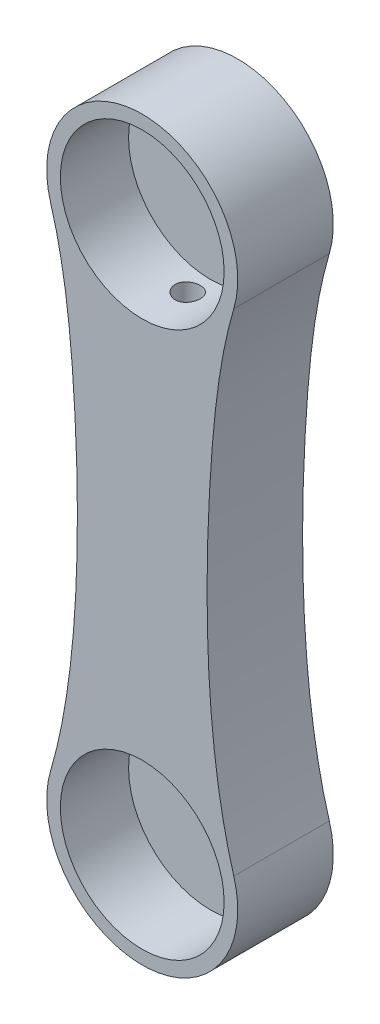
ISO-10303-21;
HEADER;
FILE_DESCRIPTION(('STEP AP214'),'2;1');
FILE_NAME('part.step','',(''),(''),'','','');
FILE_SCHEMA(('AUTOMOTIVE_DESIGN { 1 0 10303 214 1 1 1 1 }'));
ENDSEC;
DATA;
#1=APPLICATION_CONTEXT('core data for automotive mechanical design processes');
#2=APPLICATION_PROTOCOL_DEFINITION('international standard','automotive_design',2000,#1);
#3=PRODUCT_CONTEXT('',#1,'mechanical');
#4=PRODUCT('Part','Part','',(#3));
#5=PRODUCT_RELATED_PRODUCT_CATEGORY('part','',(#4));
#6=PRODUCT_DEFINITION_FORMATION('','',#4);
#7=PRODUCT_DEFINITION_CONTEXT('part definition',#1,'design');
#8=PRODUCT_DEFINITION('design','',#6,#7);
#9=PRODUCT_DEFINITION_SHAPE('','',#8);
#10=(LENGTH_UNIT() NAMED_UNIT(*) SI_UNIT(.MILLI.,.METRE.));
#11=(NAMED_UNIT(*) PLANE_ANGLE_UNIT() SI_UNIT($,.RADIAN.));
#12=(NAMED_UNIT(*) SI_UNIT($,.STERADIAN.) SOLID_ANGLE_UNIT());
#13=UNCERTAINTY_MEASURE_WITH_UNIT(LENGTH_MEASURE(1.E-05),#10,'distance_accuracy_value','');
#14=(GEOMETRIC_REPRESENTATION_CONTEXT(3) GLOBAL_UNCERTAINTY_ASSIGNED_CONTEXT((#13)) GLOBAL_UNIT_ASSIGNED_CONTEXT((#10,
#11,#12)) REPRESENTATION_CONTEXT('',''));
#15=CARTESIAN_POINT('',(0.,0.,0.));
#16=DIRECTION('',(0.,0.,1.));
#17=DIRECTION('',(1.,0.,0.));
#18=AXIS2_PLACEMENT_3D('',#15,#16,#17);
#19=CARTESIAN_POINT('',(0.,0.,21.));
#20=DIRECTION('',(0.,0.,-1.));
#21=DIRECTION('',(-1.,0.,0.));
#22=AXIS2_PLACEMENT_3D('',#19,#20,#21);
#23=CYLINDRICAL_SURFACE('',#22,18.);
#24=CARTESIAN_POINT('',(0.,0.,21.));
#25=DIRECTION('',(0.,0.,-1.));
#26=DIRECTION('',(-1.,0.,0.));
#27=AXIS2_PLACEMENT_3D('',#24,#25,#26);
#28=CIRCLE('',#27,18.);
#29=CARTESIAN_POINT('',(-18.,0.,21.));
#30=VERTEX_POINT('',#29);
#31=EDGE_CURVE('E105',#30,#30,#28,.T.);
#32=ORIENTED_EDGE('',*,*,#31,.F.);
#33=EDGE_LOOP('',(#32));
#34=FACE_BOUND('',#33,.T.);
#35=CARTESIAN_POINT('',(0.,0.,6.));
#36=DIRECTION('',(0.,0.,-1.));
#37=DIRECTION('',(-1.,0.,0.));
#38=AXIS2_PLACEMENT_3D('',#35,#36,#37);
#39=CIRCLE('',#38,18.);
#40=CARTESIAN_POINT('',(-18.,0.,6.));
#41=VERTEX_POINT('',#40);
#42=EDGE_CURVE('E102',#41,#41,#39,.T.);
#43=ORIENTED_EDGE('',*,*,#42,.T.);
#44=EDGE_LOOP('',(#43));
#45=FACE_BOUND('',#44,.T.);
#46=CARTESIAN_POINT('',(0.,18.,8.25));
#47=CARTESIAN_POINT('',(0.153510258517771,17.9999975087137,8.25000630431983));
#48=CARTESIAN_POINT('',(0.307108748270858,17.9980156561663,8.26289725277757));
#49=CARTESIAN_POINT('',(0.610010082310018,17.9903004084711,8.31410605565049));
#50=CARTESIAN_POINT('',(0.759308635853718,17.9845633929638,8.35244844835525));
#51=CARTESIAN_POINT('',(1.04918287274459,17.969982334475,8.45338573914497));
#52=CARTESIAN_POINT('',(1.18976514062071,17.9611406713259,8.51596206475397));
#53=CARTESIAN_POINT('',(1.45841306108697,17.9413265448084,8.66354499251799));
#54=CARTESIAN_POINT('',(1.58648039955886,17.9303543690371,8.74854856778228));
#55=CARTESIAN_POINT('',(1.82752030414948,17.9073994709621,8.93930574803975));
#56=CARTESIAN_POINT('',(1.94037692534286,17.8954100101608,9.04520506513373));
#57=CARTESIAN_POINT('',(2.14679126635228,17.8718243838362,9.27443405949152));
#58=CARTESIAN_POINT('',(2.24034785947817,17.8602282413069,9.39776475365022));
#59=CARTESIAN_POINT('',(2.40595992062668,17.8386768463986,9.65913745494312));
#60=CARTESIAN_POINT('',(2.47790280796093,17.8287303026849,9.79725157634658));
#61=CARTESIAN_POINT('',(2.59752573034174,17.8116965351506,10.0837804784073));
#62=CARTESIAN_POINT('',(2.64520713777126,17.8046091496026,10.2321946758872));
#63=CARTESIAN_POINT('',(2.71459266740928,17.7941625416485,10.5338898059226));
#64=CARTESIAN_POINT('',(2.73649556526652,17.7907748064245,10.6871240175174));
#65=CARTESIAN_POINT('',(2.75431820425983,17.7880245579266,10.9951274204015));
#66=CARTESIAN_POINT('',(2.75023949233129,17.7886618050067,11.1498965197562));
#67=CARTESIAN_POINT('',(2.7163770490849,17.7938634536805,11.4551698443492));
#68=CARTESIAN_POINT('',(2.68681500833727,17.7983939848453,11.6056993210139));
#69=CARTESIAN_POINT('',(2.60317223914235,17.8108187972326,11.8996361637298));
#70=CARTESIAN_POINT('',(2.54909079339747,17.8187131768617,12.0430433212865));
#71=CARTESIAN_POINT('',(2.4177147460771,17.8370134687077,12.3193374968786));
#72=CARTESIAN_POINT('',(2.34032653761683,17.8474294748001,12.4521793094906));
#73=CARTESIAN_POINT('',(2.16460036352424,17.8695921483484,12.7030756114045));
#74=CARTESIAN_POINT('',(2.06626097233227,17.8813389063258,12.8211290936111));
#75=CARTESIAN_POINT('',(1.85020847244248,17.9049890384903,13.0403822134443));
#76=CARTESIAN_POINT('',(1.7323048238499,17.9168927725239,13.1413941482134));
#77=CARTESIAN_POINT('',(1.48111927155989,17.9394024291803,13.3222260846295));
#78=CARTESIAN_POINT('',(1.34783729589168,17.9500083457288,13.4020459870917));
#79=CARTESIAN_POINT('',(1.06951357586518,17.968739053657,13.5382389003901));
#80=CARTESIAN_POINT('',(0.924464468827094,17.9768622762281,13.5945970939362));
#81=CARTESIAN_POINT('',(0.626808641329192,17.9896993017723,13.6821018493669));
#82=CARTESIAN_POINT('',(0.474202451886373,17.9944133439376,13.7132501800246));
#83=CARTESIAN_POINT('',(0.167384048823863,17.9998691068971,13.7492006531667));
#84=CARTESIAN_POINT('',(0.0132027310975914,18.0006497246001,13.7542607886286));
#85=CARTESIAN_POINT('',(-0.293806390814619,17.9982566697091,13.7385765097297));
#86=CARTESIAN_POINT('',(-0.446634238356828,17.9950831242453,13.7178329249833));
#87=CARTESIAN_POINT('',(-0.745814269065547,17.985162385829,13.6513445841472));
#88=CARTESIAN_POINT('',(-0.892195106608153,17.9784332110028,13.605725845786));
#89=CARTESIAN_POINT('',(-1.17523067164803,17.9621531873542,13.4909152688788));
#90=CARTESIAN_POINT('',(-1.31188492730701,17.9526022017608,13.4217222876829));
#91=CARTESIAN_POINT('',(-1.57272046839778,17.9316429904409,13.2611243928961));
#92=CARTESIAN_POINT('',(-1.69680013611226,17.9202213273972,13.1695562227642));
#93=CARTESIAN_POINT('',(-1.92792337862103,17.8968329827325,12.9670340931923));
#94=CARTESIAN_POINT('',(-2.03496592349731,17.8848662682185,12.8560789626332));
#95=CARTESIAN_POINT('',(-2.2299179391743,17.861612814413,12.6167825887925));
#96=CARTESIAN_POINT('',(-2.3176542434972,17.8503328377567,12.488299511022));
#97=CARTESIAN_POINT('',(-2.47029869195267,17.8298508320571,12.2182678145842));
#98=CARTESIAN_POINT('',(-2.53520747082072,17.8206487452393,12.0767195593415));
#99=CARTESIAN_POINT('',(-2.64008745388828,17.805413657673,11.7850867612954));
#100=CARTESIAN_POINT('',(-2.68014899573831,17.7993691895002,11.6350353322365));
#101=CARTESIAN_POINT('',(-2.73448433240165,17.7911034959988,11.3302345379749));
#102=CARTESIAN_POINT('',(-2.74875998066007,17.7888819958825,11.1754855112404));
#103=CARTESIAN_POINT('',(-2.75107298476152,17.7885242812649,10.8674087667602));
#104=CARTESIAN_POINT('',(-2.73938266024937,17.7903456666345,10.7140830735628));
#105=CARTESIAN_POINT('',(-2.69067997372575,17.7977762258774,10.4116058884679));
#106=CARTESIAN_POINT('',(-2.65366765844647,17.8033853927602,10.2624543888674));
#107=CARTESIAN_POINT('',(-2.55546923335161,17.8177444724682,9.97263970594377));
#108=CARTESIAN_POINT('',(-2.4943028661927,17.8264918197243,9.83196969812316));
#109=CARTESIAN_POINT('',(-2.34955984767611,17.8461446687613,9.56284431822716));
#110=CARTESIAN_POINT('',(-2.26598238045251,17.8570502491079,9.43438939106691));
#111=CARTESIAN_POINT('',(-2.07780301902395,17.8799268025333,9.19195817756364));
#112=CARTESIAN_POINT('',(-1.97299964094955,17.8919073213498,9.07813916851574));
#113=CARTESIAN_POINT('',(-1.74576924513527,17.915504732014,8.86960738777306));
#114=CARTESIAN_POINT('',(-1.62333814217073,17.9271215388095,8.77489905722932));
#115=CARTESIAN_POINT('',(-1.36350194297468,17.9487587527383,8.6067909532809));
#116=CARTESIAN_POINT('',(-1.22601517647366,17.9587696452251,8.53351620440508));
#117=CARTESIAN_POINT('',(-0.940596026165886,17.9759739335688,8.41120972055464));
#118=CARTESIAN_POINT('',(-0.792674575175969,17.983170228118,8.36215303020471));
#119=CARTESIAN_POINT('',(-0.536752834354808,17.9923033126744,8.3007278113183));
#120=CARTESIAN_POINT('',(-0.430327461410827,17.9951746513034,8.28173417460848));
#121=CARTESIAN_POINT('',(-0.215949268370734,17.9990238588584,8.25636813424484));
#122=CARTESIAN_POINT('',(-0.107996468354256,18.0000017526523,8.2499955648288));
#123=CARTESIAN_POINT('',(0.,18.,8.25));
#124=B_SPLINE_CURVE_WITH_KNOTS('',3,(#46,#47,#48,#49,#50,#51,#52,#53,#54,#55,#56,#57,#58,#59,
#60,#61,#62,#63,#64,#65,#66,#67,#68,#69,#70,#71,#72,#73,#74,#75,#76,#77,#78,#79,#80,#81,#82,#83,
#84,#85,#86,#87,#88,#89,#90,#91,#92,#93,#94,#95,#96,#97,#98,#99,#100,#101,#102,#103,#104,#105,
#106,#107,#108,#109,#110,#111,#112,#113,#114,#115,#116,#117,#118,#119,#120,#121,#122,#123),
.UNSPECIFIED.,.T.,.F.,(4,2,2,2,2,2,2,2,2,2,2,2,2,2,2,2,2,2,2,2,2,2,2,2,2,2,2,2,2,2,2,2,2,2,2,2,
2,2,4),(0.,0.460136124640792,0.920716522098308,1.38094463484242,1.84111066470757,
2.30460682483341,2.7681300351205,3.2340273592665,3.69989832637877,4.1621529685864,
4.62438008858149,5.08262621381426,5.54088574557351,6.00101090061293,6.46116737347662,
6.92610123230582,7.39103726711966,7.85626648939698,8.3214630674566,8.78205024767518,
9.24262261995608,9.7008831180374,10.1591658312913,10.6208977680364,11.0826576065327,
11.5484041018128,12.014137645658,12.4781678304506,12.9421646602345,13.4013182963538,
13.8604710850991,14.3192493530375,14.7780443248586,15.2414177016224,15.7048986385179,
16.1710315324576,16.6366830942957,16.9603991089365,17.2841108719368),.UNSPECIFIED.);
#125=CARTESIAN_POINT('',(0.,18.,8.25));
#126=VERTEX_POINT('',#125);
#127=EDGE_CURVE('E107',#126,#126,#124,.T.);
#128=ORIENTED_EDGE('',*,*,#127,.F.);
#129=EDGE_LOOP('',(#128));
#130=FACE_BOUND('',#129,.T.);
#131=ADVANCED_FACE('F35',(#34,#45,#130),#23,.F.);
#132=CARTESIAN_POINT('',(0.,120.,21.));
#133=DIRECTION('',(0.,0.,-1.));
#134=DIRECTION('',(-1.,0.,0.));
#135=AXIS2_PLACEMENT_3D('',#132,#133,#134);
#136=CYLINDRICAL_SURFACE('',#135,18.);
#137=CARTESIAN_POINT('',(0.,120.,21.));
#138=DIRECTION('',(0.,0.,-1.));
#139=DIRECTION('',(-1.,0.,0.));
#140=AXIS2_PLACEMENT_3D('',#137,#138,#139);
#141=CIRCLE('',#140,18.);
#142=CARTESIAN_POINT('',(-18.,120.,21.));
#143=VERTEX_POINT('',#142);
#144=EDGE_CURVE('E99',#143,#143,#141,.T.);
#145=ORIENTED_EDGE('',*,*,#144,.F.);
#146=EDGE_LOOP('',(#145));
#147=FACE_BOUND('',#146,.T.);
#148=CARTESIAN_POINT('',(0.,120.,6.));
#149=DIRECTION('',(0.,0.,-1.));
#150=DIRECTION('',(-1.,0.,0.));
#151=AXIS2_PLACEMENT_3D('',#148,#149,#150);
#152=CIRCLE('',#151,18.);
#153=CARTESIAN_POINT('',(-18.,120.,6.));
#154=VERTEX_POINT('',#153);
#155=EDGE_CURVE('E120',#154,#154,#152,.T.);
#156=ORIENTED_EDGE('',*,*,#155,.T.);
#157=EDGE_LOOP('',(#156));
#158=FACE_BOUND('',#157,.T.);
#159=CARTESIAN_POINT('',(0.,102.,8.25));
#160=CARTESIAN_POINT('',(-0.15351025851777,102.000002491286,8.25000630431983));
#161=CARTESIAN_POINT('',(-0.307108748270857,102.001984343834,8.26289725277757));
#162=CARTESIAN_POINT('',(-0.610010082310017,102.009699591529,8.31410605565049));
#163=CARTESIAN_POINT('',(-0.759308635853718,102.015436607036,8.35244844835525));
#164=CARTESIAN_POINT('',(-1.04918287274459,102.030017665525,8.45338573914497));
#165=CARTESIAN_POINT('',(-1.18976514062071,102.038859328674,8.51596206475397));
#166=CARTESIAN_POINT('',(-1.45841306108697,102.058673455192,8.66354499251799));
#167=CARTESIAN_POINT('',(-1.58648039955886,102.069645630963,8.74854856778228));
#168=CARTESIAN_POINT('',(-1.82752030414948,102.092600529038,8.93930574803975));
#169=CARTESIAN_POINT('',(-1.94037692534286,102.104589989839,9.04520506513373));
#170=CARTESIAN_POINT('',(-2.14679126635228,102.128175616164,9.27443405949152));
#171=CARTESIAN_POINT('',(-2.24034785947817,102.139771758693,9.39776475365022));
#172=CARTESIAN_POINT('',(-2.40595992062668,102.161323153601,9.65913745494312));
#173=CARTESIAN_POINT('',(-2.47790280796093,102.171269697315,9.79725157634658));
#174=CARTESIAN_POINT('',(-2.59752573034174,102.188303464849,10.0837804784073));
#175=CARTESIAN_POINT('',(-2.64520713777126,102.195390850397,10.2321946758872));
#176=CARTESIAN_POINT('',(-2.71459266740928,102.205837458352,10.5338898059226));
#177=CARTESIAN_POINT('',(-2.73649556526652,102.209225193575,10.6871240175174));
#178=CARTESIAN_POINT('',(-2.75431820425983,102.211975442073,10.9951274204015));
#179=CARTESIAN_POINT('',(-2.75023949233129,102.211338194993,11.1498965197562));
#180=CARTESIAN_POINT('',(-2.7163770490849,102.20613654632,11.4551698443492));
#181=CARTESIAN_POINT('',(-2.68681500833727,102.201606015155,11.6056993210139));
#182=CARTESIAN_POINT('',(-2.60317223914235,102.189181202767,11.8996361637298));
#183=CARTESIAN_POINT('',(-2.54909079339747,102.181286823138,12.0430433212865));
#184=CARTESIAN_POINT('',(-2.4177147460771,102.162986531292,12.3193374968786));
#185=CARTESIAN_POINT('',(-2.34032653761683,102.1525705252,12.4521793094906));
#186=CARTESIAN_POINT('',(-2.16460036352424,102.130407851652,12.7030756114045));
#187=CARTESIAN_POINT('',(-2.06626097233227,102.118661093674,12.8211290936111));
#188=CARTESIAN_POINT('',(-1.85020847244248,102.09501096151,13.0403822134443));
#189=CARTESIAN_POINT('',(-1.7323048238499,102.083107227476,13.1413941482134));
#190=CARTESIAN_POINT('',(-1.48111927155988,102.06059757082,13.3222260846295));
#191=CARTESIAN_POINT('',(-1.34783729589168,102.049991654271,13.4020459870917));
#192=CARTESIAN_POINT('',(-1.06951357586518,102.031260946343,13.5382389003901));
#193=CARTESIAN_POINT('',(-0.924464468827092,102.023137723772,13.5945970939362));
#194=CARTESIAN_POINT('',(-0.62680864132919,102.010300698228,13.6821018493669));
#195=CARTESIAN_POINT('',(-0.474202451886371,102.005586656062,13.7132501800246));
#196=CARTESIAN_POINT('',(-0.167384048823861,102.000130893103,13.7492006531667));
#197=CARTESIAN_POINT('',(-0.0132027310975895,101.9993502754,13.7542607886286));
#198=CARTESIAN_POINT('',(0.293806390814621,102.001743330291,13.7385765097297));
#199=CARTESIAN_POINT('',(0.44663423835683,102.004916875755,13.7178329249833));
#200=CARTESIAN_POINT('',(0.745814269065549,102.014837614171,13.6513445841472));
#201=CARTESIAN_POINT('',(0.892195106608154,102.021566788997,13.605725845786));
#202=CARTESIAN_POINT('',(1.17523067164804,102.037846812646,13.4909152688788));
#203=CARTESIAN_POINT('',(1.31188492730701,102.047397798239,13.4217222876829));
#204=CARTESIAN_POINT('',(1.57272046839778,102.068357009559,13.2611243928961));
#205=CARTESIAN_POINT('',(1.69680013611226,102.079778672603,13.1695562227642));
#206=CARTESIAN_POINT('',(1.92792337862103,102.103167017267,12.9670340931923));
#207=CARTESIAN_POINT('',(2.03496592349732,102.115133731781,12.8560789626332));
#208=CARTESIAN_POINT('',(2.22991793917431,102.138387185587,12.6167825887925));
#209=CARTESIAN_POINT('',(2.3176542434972,102.149667162243,12.488299511022));
#210=CARTESIAN_POINT('',(2.47029869195267,102.170149167943,12.2182678145842));
#211=CARTESIAN_POINT('',(2.53520747082072,102.179351254761,12.0767195593415));
#212=CARTESIAN_POINT('',(2.64008745388828,102.194586342327,11.7850867612954));
#213=CARTESIAN_POINT('',(2.68014899573831,102.2006308105,11.6350353322365));
#214=CARTESIAN_POINT('',(2.73448433240165,102.208896504001,11.3302345379749));
#215=CARTESIAN_POINT('',(2.74875998066007,102.211118004118,11.1754855112404));
#216=CARTESIAN_POINT('',(2.75107298476152,102.211475718735,10.8674087667602));
#217=CARTESIAN_POINT('',(2.73938266024937,102.209654333365,10.7140830735628));
#218=CARTESIAN_POINT('',(2.69067997372575,102.202223774123,10.4116058884679));
#219=CARTESIAN_POINT('',(2.65366765844647,102.19661460724,10.2624543888674));
#220=CARTESIAN_POINT('',(2.55546923335161,102.182255527532,9.97263970594376));
#221=CARTESIAN_POINT('',(2.4943028661927,102.173508180276,9.83196969812315));
#222=CARTESIAN_POINT('',(2.34955984767611,102.153855331239,9.56284431822716));
#223=CARTESIAN_POINT('',(2.2659823804525,102.142949750892,9.43438939106691));
#224=CARTESIAN_POINT('',(2.07780301902394,102.120073197467,9.19195817756363));
#225=CARTESIAN_POINT('',(1.97299964094955,102.10809267865,9.07813916851574));
#226=CARTESIAN_POINT('',(1.74576924513526,102.084495267986,8.86960738777306));
#227=CARTESIAN_POINT('',(1.62333814217072,102.07287846119,8.77489905722932));
#228=CARTESIAN_POINT('',(1.36350194297467,102.051241247262,8.60679095328089));
#229=CARTESIAN_POINT('',(1.22601517647366,102.041230354775,8.53351620440508));
#230=CARTESIAN_POINT('',(0.940596026165884,102.024026066431,8.41120972055464));
#231=CARTESIAN_POINT('',(0.792674575175967,102.016829771882,8.36215303020471));
#232=CARTESIAN_POINT('',(0.536752834354805,102.007696687326,8.3007278113183));
#233=CARTESIAN_POINT('',(0.430327461410824,102.004825348697,8.28173417460848));
#234=CARTESIAN_POINT('',(0.215949268370732,102.000976141142,8.25636813424484));
#235=CARTESIAN_POINT('',(0.107996468354255,101.999998247348,8.2499955648288));
#236=CARTESIAN_POINT('',(0.,102.,8.25));
#237=B_SPLINE_CURVE_WITH_KNOTS('',3,(#159,#160,#161,#162,#163,#164,#165,#166,#167,#168,#169,
#170,#171,#172,#173,#174,#175,#176,#177,#178,#179,#180,#181,#182,#183,#184,#185,#186,#187,#188,
#189,#190,#191,#192,#193,#194,#195,#196,#197,#198,#199,#200,#201,#202,#203,#204,#205,#206,#207,
#208,#209,#210,#211,#212,#213,#214,#215,#216,#217,#218,#219,#220,#221,#222,#223,#224,#225,#226,
#227,#228,#229,#230,#231,#232,#233,#234,#235,#236),.UNSPECIFIED.,.T.,.F.,(4,2,2,2,2,2,2,2,2,2,2,
2,2,2,2,2,2,2,2,2,2,2,2,2,2,2,2,2,2,2,2,2,2,2,2,2,2,2,4),(0.,0.460136124640791,
0.920716522098308,1.38094463484242,1.84111066470757,2.30460682483341,2.7681300351205,
3.23402735926651,3.69989832637877,4.1621529685864,4.62438008858149,5.08262621381427,
5.54088574557351,6.00101090061293,6.46116737347662,6.92610123230582,7.39103726711966,
7.85626648939698,8.32146306745661,8.78205024767519,9.24262261995608,9.7008831180374,
10.1591658312913,10.6208977680364,11.0826576065327,11.5484041018128,12.014137645658,
12.4781678304506,12.9421646602345,13.4013182963538,13.8604710850991,14.3192493530375,
14.7780443248586,15.2414177016224,15.7048986385179,16.1710315324576,16.6366830942957,
16.9603991089365,17.2841108719368),.UNSPECIFIED.);
#238=CARTESIAN_POINT('',(0.,102.,8.25));
#239=VERTEX_POINT('',#238);
#240=EDGE_CURVE('E39',#239,#239,#237,.T.);
#241=ORIENTED_EDGE('',*,*,#240,.F.);
#242=EDGE_LOOP('',(#241));
#243=FACE_BOUND('',#242,.T.);
#244=ADVANCED_FACE('F144',(#147,#158,#243),#136,.F.);
#245=CARTESIAN_POINT('',(0.,120.,21.));
#246=DIRECTION('',(0.,0.,-1.));
#247=DIRECTION('',(-1.,0.,0.));
#248=AXIS2_PLACEMENT_3D('',#245,#246,#247);
#249=CYLINDRICAL_SURFACE('',#248,21.);
#250=CARTESIAN_POINT('',(0.,120.,0.));
#251=DIRECTION('',(0.,0.,1.));
#252=DIRECTION('',(1.,0.,0.));
#253=AXIS2_PLACEMENT_3D('',#250,#251,#252);
#254=CIRCLE('',#253,21.);
#255=CARTESIAN_POINT('',(20.1246118072066,114.000000032563,0.));
#256=VERTEX_POINT('',#255);
#257=CARTESIAN_POINT('',(-20.1246117974981,114.,0.));
#258=VERTEX_POINT('',#257);
#259=EDGE_CURVE('E87',#256,#258,#254,.T.);
#260=ORIENTED_EDGE('',*,*,#259,.T.);
#261=DIRECTION('',(0.,0.,-1.));
#262=VECTOR('',#261,1.);
#263=CARTESIAN_POINT('',(-20.1246117974981,114.,21.));
#264=LINE('',#263,#262);
#265=CARTESIAN_POINT('',(-20.1246117974981,114.,21.));
#266=VERTEX_POINT('',#265);
#267=EDGE_CURVE('E91',#266,#258,#264,.T.);
#268=ORIENTED_EDGE('',*,*,#267,.F.);
#269=CARTESIAN_POINT('',(0.,120.,21.));
#270=DIRECTION('',(0.,0.,1.));
#271=DIRECTION('',(1.,0.,0.));
#272=AXIS2_PLACEMENT_3D('',#269,#270,#271);
#273=CIRCLE('',#272,21.);
#274=CARTESIAN_POINT('',(20.1246117974981,114.,21.));
#275=VERTEX_POINT('',#274);
#276=EDGE_CURVE('E89',#275,#266,#273,.T.);
#277=ORIENTED_EDGE('',*,*,#276,.F.);
#278=DIRECTION('',(0.,0.,-1.));
#279=VECTOR('',#278,1.);
#280=CARTESIAN_POINT('',(20.1246117974981,114.,21.));
#281=LINE('',#280,#279);
#282=EDGE_CURVE('E49',#275,#256,#281,.T.);
#283=ORIENTED_EDGE('',*,*,#282,.T.);
#284=EDGE_LOOP('',(#260,#268,#277,#283));
#285=FACE_BOUND('',#284,.T.);
#286=ADVANCED_FACE('F85',(#285),#249,.T.);
#287=CARTESIAN_POINT('',(0.,0.,5.));
#288=DIRECTION('',(0.,0.,-1.));
#289=DIRECTION('',(-1.,0.,0.));
#290=AXIS2_PLACEMENT_3D('',#287,#288,#289);
#291=CYLINDRICAL_SURFACE('',#290,21.);
#292=DIRECTION('',(0.,0.,-1.));
#293=VECTOR('',#292,1.);
#294=CARTESIAN_POINT('',(-20.1246117974981,5.99999999999998,21.));
#295=LINE('',#294,#293);
#296=CARTESIAN_POINT('',(-20.1246117974981,5.99999999999998,21.));
#297=VERTEX_POINT('',#296);
#298=CARTESIAN_POINT('',(-20.1246118001466,5.99999999111683,0.));
#299=VERTEX_POINT('',#298);
#300=EDGE_CURVE('E55',#297,#299,#295,.T.);
#301=ORIENTED_EDGE('',*,*,#300,.T.);
#302=CARTESIAN_POINT('',(0.,0.,0.));
#303=DIRECTION('',(0.,0.,1.));
#304=DIRECTION('',(1.,0.,0.));
#305=AXIS2_PLACEMENT_3D('',#302,#303,#304);
#306=CIRCLE('',#305,21.);
#307=CARTESIAN_POINT('',(20.1246117974981,6.,0.));
#308=VERTEX_POINT('',#307);
#309=EDGE_CURVE('E11',#299,#308,#306,.T.);
#310=ORIENTED_EDGE('',*,*,#309,.T.);
#311=DIRECTION('',(0.,0.,-1.));
#312=VECTOR('',#311,1.);
#313=CARTESIAN_POINT('',(20.1246117974981,6.,21.));
#314=LINE('',#313,#312);
#315=CARTESIAN_POINT('',(20.1246117974981,6.,21.));
#316=VERTEX_POINT('',#315);
#317=EDGE_CURVE('E63',#316,#308,#314,.T.);
#318=ORIENTED_EDGE('',*,*,#317,.F.);
#319=CARTESIAN_POINT('',(0.,0.,21.));
#320=DIRECTION('',(0.,0.,1.));
#321=DIRECTION('',(1.,0.,0.));
#322=AXIS2_PLACEMENT_3D('',#319,#320,#321);
#323=CIRCLE('',#322,21.);
#324=EDGE_CURVE('E197',#297,#316,#323,.T.);
#325=ORIENTED_EDGE('',*,*,#324,.F.);
#326=EDGE_LOOP('',(#301,#310,#318,#325));
#327=FACE_BOUND('',#326,.T.);
#328=ADVANCED_FACE('F138',(#327),#291,.T.);
#329=CARTESIAN_POINT('',(0.,0.,0.));
#330=DIRECTION('',(0.,0.,1.));
#331=DIRECTION('',(1.,0.,0.));
#332=AXIS2_PLACEMENT_3D('',#329,#330,#331);
#333=PLANE('',#332);
#334=ORIENTED_EDGE('',*,*,#309,.F.);
#335=CARTESIAN_POINT('',(-20.1246117974981,114.,0.));
#336=CARTESIAN_POINT('',(-17.0726623184333,103.763450251374,0.));
#337=CARTESIAN_POINT('',(-12.9542001169747,66.8976134133637,0.));
#338=CARTESIAN_POINT('',(-14.1806763598555,25.9365655386583,0.));
#339=CARTESIAN_POINT('',(-20.1246117974981,5.99999999999998,0.));
#340=B_SPLINE_CURVE_WITH_KNOTS('',3,(#335,#336,#337,#338,#339),.UNSPECIFIED.,.F.,.F.,(4,1,4),
(0.,0.31672468470437,1.),.UNSPECIFIED.);
#341=EDGE_CURVE('E97',#258,#299,#340,.T.);
#342=ORIENTED_EDGE('',*,*,#341,.F.);
#343=ORIENTED_EDGE('',*,*,#259,.F.);
#344=CARTESIAN_POINT('',(20.1246117974981,114.,0.));
#345=CARTESIAN_POINT('',(17.0726623184333,103.763450251374,0.));
#346=CARTESIAN_POINT('',(12.9542001169747,66.8976134133637,0.));
#347=CARTESIAN_POINT('',(14.1806763598555,25.9365655386583,0.));
#348=CARTESIAN_POINT('',(20.1246117974981,6.00000000000001,0.));
#349=B_SPLINE_CURVE_WITH_KNOTS('',3,(#344,#345,#346,#347,#348),.UNSPECIFIED.,.F.,.F.,(4,1,4),
(0.,0.31672468470437,1.),.UNSPECIFIED.);
#350=EDGE_CURVE('E95',#256,#308,#349,.T.);
#351=ORIENTED_EDGE('',*,*,#350,.T.);
#352=EDGE_LOOP('',(#334,#342,#343,#351));
#353=FACE_BOUND('',#352,.T.);
#354=ADVANCED_FACE('F37',(#353),#333,.F.);
#355=CARTESIAN_POINT('',(20.1246117974981,114.,21.));
#356=CARTESIAN_POINT('',(17.0726623184333,103.763450251374,21.));
#357=CARTESIAN_POINT('',(12.9542001169747,66.8976134133637,21.));
#358=CARTESIAN_POINT('',(14.1806763598555,25.9365655386583,21.));
#359=CARTESIAN_POINT('',(20.1246117974981,6.00000000000001,21.));
#360=B_SPLINE_CURVE_WITH_KNOTS('',3,(#355,#356,#357,#358,#359),.UNSPECIFIED.,.F.,.F.,(4,1,4),
(0.,0.31672468470437,1.),.UNSPECIFIED.);
#361=DIRECTION('',(0.,0.,-1.));
#362=VECTOR('',#361,1.);
#363=SURFACE_OF_LINEAR_EXTRUSION('',#360,#362);
#364=ORIENTED_EDGE('',*,*,#317,.T.);
#365=ORIENTED_EDGE('',*,*,#350,.F.);
#366=ORIENTED_EDGE('',*,*,#282,.F.);
#367=EDGE_CURVE('E98',#275,#316,#360,.T.);
#368=ORIENTED_EDGE('',*,*,#367,.T.);
#369=EDGE_LOOP('',(#364,#365,#366,#368));
#370=FACE_BOUND('',#369,.T.);
#371=ADVANCED_FACE('F101',(#370),#363,.T.);
#372=CARTESIAN_POINT('',(-20.1246117974981,114.,21.));
#373=CARTESIAN_POINT('',(-17.0726623184333,103.763450251374,21.));
#374=CARTESIAN_POINT('',(-12.9542001169747,66.8976134133637,21.));
#375=CARTESIAN_POINT('',(-14.1806763598555,25.9365655386583,21.));
#376=CARTESIAN_POINT('',(-20.1246117974981,5.99999999999998,21.));
#377=B_SPLINE_CURVE_WITH_KNOTS('',3,(#372,#373,#374,#375,#376),.UNSPECIFIED.,.F.,.F.,(4,1,4),
(0.,0.31672468470437,1.),.UNSPECIFIED.);
#378=DIRECTION('',(0.,0.,-1.));
#379=VECTOR('',#378,1.);
#380=SURFACE_OF_LINEAR_EXTRUSION('',#377,#379);
#381=ORIENTED_EDGE('',*,*,#267,.T.);
#382=ORIENTED_EDGE('',*,*,#341,.T.);
#383=ORIENTED_EDGE('',*,*,#300,.F.);
#384=EDGE_CURVE('E199',#266,#297,#377,.T.);
#385=ORIENTED_EDGE('',*,*,#384,.F.);
#386=EDGE_LOOP('',(#381,#382,#383,#385));
#387=FACE_BOUND('',#386,.T.);
#388=ADVANCED_FACE('F136',(#387),#380,.F.);
#389=CARTESIAN_POINT('',(0.,0.,21.));
#390=DIRECTION('',(0.,0.,1.));
#391=DIRECTION('',(1.,0.,0.));
#392=AXIS2_PLACEMENT_3D('',#389,#390,#391);
#393=PLANE('',#392);
#394=ORIENTED_EDGE('',*,*,#144,.T.);
#395=EDGE_LOOP('',(#394));
#396=FACE_BOUND('',#395,.T.);
#397=ORIENTED_EDGE('',*,*,#31,.T.);
#398=EDGE_LOOP('',(#397));
#399=FACE_BOUND('',#398,.T.);
#400=ORIENTED_EDGE('',*,*,#367,.F.);
#401=ORIENTED_EDGE('',*,*,#276,.T.);
#402=ORIENTED_EDGE('',*,*,#384,.T.);
#403=ORIENTED_EDGE('',*,*,#324,.T.);
#404=EDGE_LOOP('',(#400,#401,#402,#403));
#405=FACE_BOUND('',#404,.T.);
#406=ADVANCED_FACE('F158',(#396,#399,#405),#393,.T.);
#407=CARTESIAN_POINT('',(0.,0.,6.));
#408=DIRECTION('',(0.,0.,-1.));
#409=DIRECTION('',(-1.,0.,0.));
#410=AXIS2_PLACEMENT_3D('',#407,#408,#409);
#411=PLANE('',#410);
#412=ORIENTED_EDGE('',*,*,#42,.F.);
#413=EDGE_LOOP('',(#412));
#414=FACE_BOUND('',#413,.T.);
#415=ADVANCED_FACE('F157',(#414),#411,.F.);
#416=CARTESIAN_POINT('',(0.,120.,6.));
#417=DIRECTION('',(0.,0.,-1.));
#418=DIRECTION('',(-1.,0.,0.));
#419=AXIS2_PLACEMENT_3D('',#416,#417,#418);
#420=PLANE('',#419);
#421=ORIENTED_EDGE('',*,*,#155,.F.);
#422=EDGE_LOOP('',(#421));
#423=FACE_BOUND('',#422,.T.);
#424=ADVANCED_FACE('F167',(#423),#420,.F.);
#425=CARTESIAN_POINT('',(0.,114.,11.));
#426=DIRECTION('',(0.,-1.,0.));
#427=DIRECTION('',(0.,0.,-1.));
#428=AXIS2_PLACEMENT_3D('',#425,#426,#427);
#429=CYLINDRICAL_SURFACE('',#428,2.75);
#430=ORIENTED_EDGE('',*,*,#240,.T.);
#431=EDGE_LOOP('',(#430));
#432=FACE_BOUND('',#431,.T.);
#433=ORIENTED_EDGE('',*,*,#127,.T.);
#434=EDGE_LOOP('',(#433));
#435=FACE_BOUND('',#434,.T.);
#436=ADVANCED_FACE('F163',(#432,#435),#429,.F.);
#437=CLOSED_SHELL('',(#131,#244,#286,#328,#354,#371,#388,#406,#415,#424,#436));
#438=MANIFOLD_SOLID_BREP('B2',#437);
#439=ADVANCED_BREP_SHAPE_REPRESENTATION('',(#18,#438),#14);
#440=SHAPE_DEFINITION_REPRESENTATION(#9,#439);
ENDSEC;
END-ISO-10303-21;
